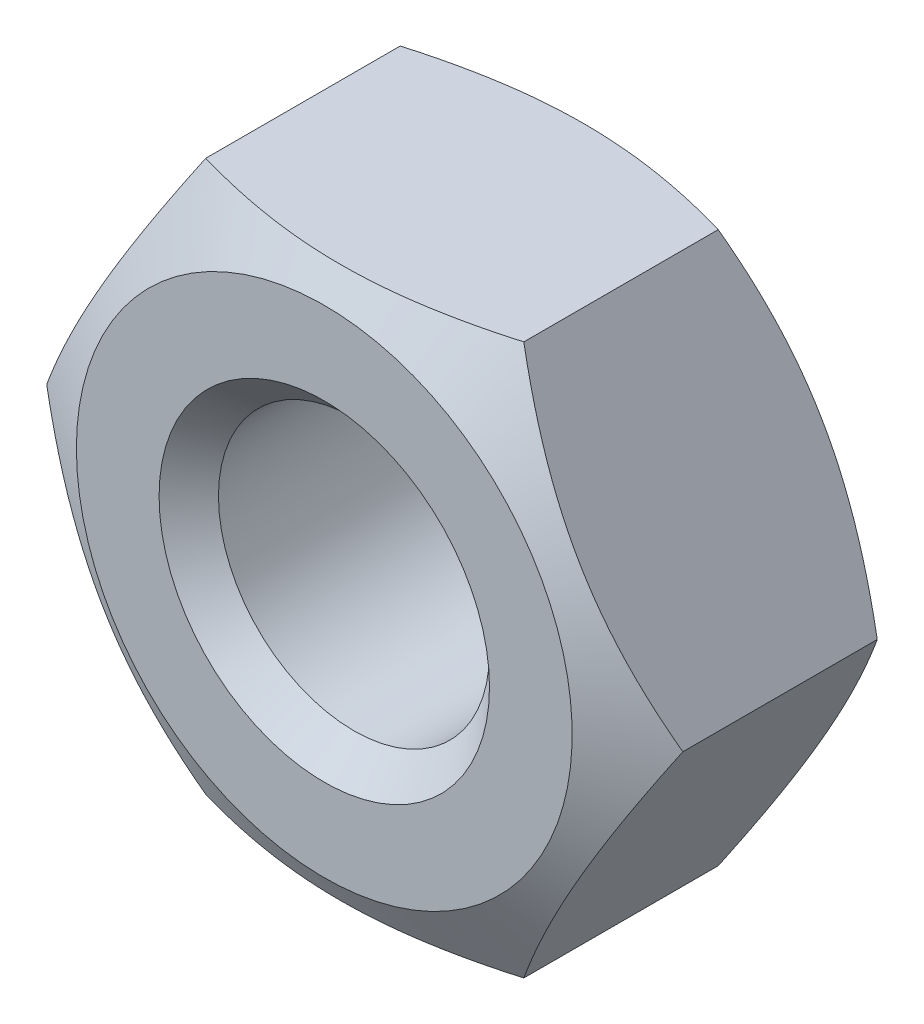
ISO-10303-21;
HEADER;
FILE_DESCRIPTION(('STEP AP214'),'2;1');
FILE_NAME('part.step','',(''),(''),'','','');
FILE_SCHEMA(('AUTOMOTIVE_DESIGN { 1 0 10303 214 1 1 1 1 }'));
ENDSEC;
DATA;
#1=APPLICATION_CONTEXT('core data for automotive mechanical design processes');
#2=APPLICATION_PROTOCOL_DEFINITION('international standard','automotive_design',2000,#1);
#3=PRODUCT_CONTEXT('',#1,'mechanical');
#4=PRODUCT('Part','Part','',(#3));
#5=PRODUCT_RELATED_PRODUCT_CATEGORY('part','',(#4));
#6=PRODUCT_DEFINITION_FORMATION('','',#4);
#7=PRODUCT_DEFINITION_CONTEXT('part definition',#1,'design');
#8=PRODUCT_DEFINITION('design','',#6,#7);
#9=PRODUCT_DEFINITION_SHAPE('','',#8);
#10=(LENGTH_UNIT() NAMED_UNIT(*) SI_UNIT(.MILLI.,.METRE.));
#11=(NAMED_UNIT(*) PLANE_ANGLE_UNIT() SI_UNIT($,.RADIAN.));
#12=(NAMED_UNIT(*) SI_UNIT($,.STERADIAN.) SOLID_ANGLE_UNIT());
#13=UNCERTAINTY_MEASURE_WITH_UNIT(LENGTH_MEASURE(1.E-05),#10,'distance_accuracy_value','');
#14=(GEOMETRIC_REPRESENTATION_CONTEXT(3) GLOBAL_UNCERTAINTY_ASSIGNED_CONTEXT((#13)) GLOBAL_UNIT_ASSIGNED_CONTEXT((#10,
#11,#12)) REPRESENTATION_CONTEXT('',''));
#15=CARTESIAN_POINT('',(0.,0.,0.));
#16=DIRECTION('',(0.,0.,1.));
#17=DIRECTION('',(1.,0.,0.));
#18=AXIS2_PLACEMENT_3D('',#15,#16,#17);
#19=CARTESIAN_POINT('',(2.88675134594651,-4.99999999999967,5.00000000000034));
#20=DIRECTION('',(-0.86602540378444,0.499999999999998,0.));
#21=DIRECTION('',(-0.5,-0.866025403784436,0.));
#22=AXIS2_PLACEMENT_3D('',#19,#20,#21);
#23=PLANE('',#22);
#24=DIRECTION('',(0.,0.,-1.));
#25=VECTOR('',#24,1.);
#26=CARTESIAN_POINT('',(5.7735026918968,1.11022302462516E-12,4.99999999999989));
#27=LINE('',#26,#25);
#28=CARTESIAN_POINT('',(5.77350269189703,3.33066907387547E-13,4.26474287801981));
#29=VERTEX_POINT('',#28);
#30=CARTESIAN_POINT('',(5.77350269189658,4.9960036108132E-13,0.735257121979638));
#31=VERTEX_POINT('',#30);
#32=EDGE_CURVE('E11',#29,#31,#27,.T.);
#33=ORIENTED_EDGE('',*,*,#32,.F.);
#34=CARTESIAN_POINT('',(5.77361816195054,0.000200000000338818,4.26467620935322));
#35=CARTESIAN_POINT('',(5.64675433465032,-0.219534594524167,4.33793829776813));
#36=CARTESIAN_POINT('',(5.51880543790509,-0.44114858445826,4.40457354348807));
#37=CARTESIAN_POINT('',(5.26069210252206,-0.88821399545187,4.52088587439572));
#38=CARTESIAN_POINT('',(5.1305230779462,-1.11367335958911,4.57052181549072));
#39=CARTESIAN_POINT('',(4.87177839004569,-1.56183230522188,4.64777383998765));
#40=CARTESIAN_POINT('',(4.74324302208332,-1.78446209310261,4.67590448712272));
#41=CARTESIAN_POINT('',(4.54998783160023,-2.11918990184482,4.70112994345301));
#42=CARTESIAN_POINT('',(4.4855253490501,-2.23084219680311,4.70671140563749));
#43=CARTESIAN_POINT('',(4.35654081066865,-2.4542499706723,4.71212264865472));
#44=CARTESIAN_POINT('',(4.29201875673899,-2.5660054462894,4.71195260714692));
#45=CARTESIAN_POINT('',(4.11524635305362,-2.87218423085036,4.70357123361224));
#46=CARTESIAN_POINT('',(4.00305457769097,-3.06650608596623,4.68949509350874));
#47=CARTESIAN_POINT('',(3.77941563226281,-3.45386010199632,4.6448596082978));
#48=CARTESIAN_POINT('',(3.66796924828281,-3.64689090137049,4.61428500525923));
#49=CARTESIAN_POINT('',(3.44387972423028,-4.03502534247406,4.53785637178519));
#50=CARTESIAN_POINT('',(3.33126486598544,-4.23007999864092,4.49167848652779));
#51=CARTESIAN_POINT('',(3.107714641578,-4.61728034535811,4.38687307091448));
#52=CARTESIAN_POINT('',(2.99677641204722,-4.80943099540761,4.32827016196887));
#53=CARTESIAN_POINT('',(2.88663587589388,-5.00020000000001,4.26467620935367));
#54=B_SPLINE_CURVE_WITH_KNOTS('',3,(#34,#35,#36,#37,#38,#39,#40,#41,#42,#43,#44,#45,#46,#47,#48,
#49,#50,#51,#52,#53),.UNSPECIFIED.,.F.,.F.,(4,2,2,2,2,2,2,2,2,4),(0.,0.792555841363204,
1.58701660053318,2.36181537487256,2.74884076077304,3.13585419177284,3.80962362599712,
4.48401723901251,5.17336882349008,5.86136694793849),.UNSPECIFIED.);
#55=CARTESIAN_POINT('',(2.88675134594696,-5.00000000000028,4.26474287802026));
#56=VERTEX_POINT('',#55);
#57=EDGE_CURVE('E195',#29,#56,#54,.T.);
#58=ORIENTED_EDGE('',*,*,#57,.T.);
#59=DIRECTION('',(0.,0.,-1.));
#60=VECTOR('',#59,1.);
#61=CARTESIAN_POINT('',(2.88675134594651,-4.99999999999967,5.00000000000034));
#62=LINE('',#61,#60);
#63=CARTESIAN_POINT('',(2.88675134594651,-4.99999999999989,0.735257121980304));
#64=VERTEX_POINT('',#63);
#65=EDGE_CURVE('E53',#56,#64,#62,.T.);
#66=ORIENTED_EDGE('',*,*,#65,.T.);
#67=CARTESIAN_POINT('',(2.88663587589322,-5.00020000000057,0.735323790646891));
#68=CARTESIAN_POINT('',(3.01349970319216,-4.78046540547511,0.662061702231952));
#69=CARTESIAN_POINT('',(3.14144859993679,-4.55885141554048,0.595426456512037));
#70=CARTESIAN_POINT('',(3.39956193531944,-4.11178600454618,0.479114125604423));
#71=CARTESIAN_POINT('',(3.52973095989552,-3.88632664040879,0.429478184509437));
#72=CARTESIAN_POINT('',(3.78847564779662,-3.43816769477587,0.352226160012454));
#73=CARTESIAN_POINT('',(3.91701101575935,-3.21553790689513,0.324095512877317));
#74=CARTESIAN_POINT('',(4.1102662062419,-2.8808100981523,0.298870056547364));
#75=CARTESIAN_POINT('',(4.17472868879166,-2.76915780319371,0.293288594363071));
#76=CARTESIAN_POINT('',(4.30371322717445,-2.54575002932512,0.287877351345449));
#77=CARTESIAN_POINT('',(4.3682352811058,-2.43399455370892,0.288047392852667));
#78=CARTESIAN_POINT('',(4.54500768479247,-2.12781576914886,0.296428766386961));
#79=CARTESIAN_POINT('',(4.65719946015232,-1.93349391403164,0.310504906491499));
#80=CARTESIAN_POINT('',(4.88083840557835,-1.54613989800073,0.355140391703246));
#81=CARTESIAN_POINT('',(4.99228478955902,-1.3531090986271,0.385714994741567));
#82=CARTESIAN_POINT('',(5.2163743136119,-0.964974657524056,0.462143628215454));
#83=CARTESIAN_POINT('',(5.3289891718564,-0.769920001357172,0.50832151347295));
#84=CARTESIAN_POINT('',(5.55253939626374,-0.382719654640242,0.613126929086239));
#85=CARTESIAN_POINT('',(5.66347762579476,-0.190569004591031,0.671729838031735));
#86=CARTESIAN_POINT('',(5.77361816194943,0.000200000000505351,0.735323790646447));
#87=B_SPLINE_CURVE_WITH_KNOTS('',3,(#67,#68,#69,#70,#71,#72,#73,#74,#75,#76,#77,#78,#79,#80,#81,
#82,#83,#84,#85,#86),.UNSPECIFIED.,.F.,.F.,(4,2,2,2,2,2,2,2,2,4),(0.,0.792555841363701,
1.58701660053438,2.36181537487431,2.74884076077502,3.13585419177501,3.80962362599876,
4.48401723901371,5.17336882349091,5.8613669479388),.UNSPECIFIED.);
#88=EDGE_CURVE('E125',#64,#31,#87,.T.);
#89=ORIENTED_EDGE('',*,*,#88,.T.);
#90=EDGE_LOOP('',(#33,#58,#66,#89));
#91=FACE_BOUND('',#90,.T.);
#92=ADVANCED_FACE('F30',(#91),#23,.F.);
#93=CARTESIAN_POINT('',(5.7735026918968,1.11022302462516E-12,4.99999999999989));
#94=DIRECTION('',(-0.866025403784439,-0.499999999999999,0.));
#95=DIRECTION('',(0.500000000000001,-0.866025403784435,0.));
#96=AXIS2_PLACEMENT_3D('',#93,#94,#95);
#97=PLANE('',#96);
#98=DIRECTION('',(0.,0.,-1.));
#99=VECTOR('',#98,1.);
#100=CARTESIAN_POINT('',(2.88675134594785,4.99999999999912,5.00000000000012));
#101=LINE('',#100,#99);
#102=CARTESIAN_POINT('',(2.88675134594785,4.99999999999923,4.26474287802003));
#103=VERTEX_POINT('',#102);
#104=CARTESIAN_POINT('',(2.88675134594829,4.99999999999989,0.735257121980082));
#105=VERTEX_POINT('',#104);
#106=EDGE_CURVE('E38',#103,#105,#101,.T.);
#107=ORIENTED_EDGE('',*,*,#106,.F.);
#108=CARTESIAN_POINT('',(2.88663587589411,5.00020000000007,4.26467620935345));
#109=CARTESIAN_POINT('',(3.01349970319411,4.7804654054752,4.33793829776738));
#110=CARTESIAN_POINT('',(3.1414485999392,4.55885141554098,4.4045735434868));
#111=CARTESIAN_POINT('',(3.39956193532214,4.11178600454721,4.52088587439398));
#112=CARTESIAN_POINT('',(3.52973095989805,3.88632664040994,4.57052181548904));
#113=CARTESIAN_POINT('',(3.78847564779869,3.43816769477716,4.64777383998622));
#114=CARTESIAN_POINT('',(3.91701101576113,3.21553790689645,4.67590448712149));
#115=CARTESIAN_POINT('',(4.11026620624405,2.88081009815417,4.70112994345121));
#116=CARTESIAN_POINT('',(4.17472868879406,2.76915780319585,4.70671140563535));
#117=CARTESIAN_POINT('',(4.30371322717577,2.54575002932691,4.71212264865361));
#118=CARTESIAN_POINT('',(4.3682352811058,2.43399455371008,4.71195260714718));
#119=CARTESIAN_POINT('',(4.54500768479139,2.1278157691495,4.70357123361362));
#120=CARTESIAN_POINT('',(4.65719946015328,1.93349391403345,4.68949509350797));
#121=CARTESIAN_POINT('',(4.88083840558086,1.54613989800332,4.64485960829548));
#122=CARTESIAN_POINT('',(4.99228478956102,1.35310909862928,4.61428500525755));
#123=CARTESIAN_POINT('',(5.21637431361363,0.96497465752581,4.53785637178403));
#124=CARTESIAN_POINT('',(5.32898917185835,0.76992000135892,4.49167848652651));
#125=CARTESIAN_POINT('',(5.55253939626585,0.382719654641867,4.38687307091319));
#126=CARTESIAN_POINT('',(5.66347762579679,0.190569004592535,4.3282701619677));
#127=CARTESIAN_POINT('',(5.77361816195077,-0.000199999999506151,4.26467620935322));
#128=B_SPLINE_CURVE_WITH_KNOTS('',3,(#108,#109,#110,#111,#112,#113,#114,#115,#116,#117,#118,
#119,#120,#121,#122,#123,#124,#125,#126,#127),.UNSPECIFIED.,.F.,.F.,(4,2,2,2,2,2,2,2,2,4),(0.,
0.792555841362968,1.58701660053319,2.36181537487258,2.74884076077297,3.13585419177259,
3.80962362599649,4.48401723901168,5.17336882348921,5.86136694793725),.UNSPECIFIED.);
#129=EDGE_CURVE('E190',#103,#29,#128,.T.);
#130=ORIENTED_EDGE('',*,*,#129,.T.);
#131=ORIENTED_EDGE('',*,*,#32,.T.);
#132=CARTESIAN_POINT('',(5.77361816194943,-0.000199999999894729,0.735323790646447));
#133=CARTESIAN_POINT('',(5.64675433465078,0.219534594525835,0.662061702232807));
#134=CARTESIAN_POINT('',(5.51880543790635,0.441148584460475,0.595426456513571));
#135=CARTESIAN_POINT('',(5.26069210252394,0.888213995454637,0.479114125606604));
#136=CARTESIAN_POINT('',(5.13052307794791,1.11367335959188,0.429478184511594));
#137=CARTESIAN_POINT('',(4.87177839004687,1.56183230522453,0.352226160014472));
#138=CARTESIAN_POINT('',(4.74324302208416,1.78446209310514,0.324095512879221));
#139=CARTESIAN_POINT('',(4.54998783160185,2.11918990184781,0.29887005654974));
#140=CARTESIAN_POINT('',(4.48552534905221,2.23084219680636,0.293288594365711));
#141=CARTESIAN_POINT('',(4.35654081066932,2.45424997067464,0.287877351347289));
#142=CARTESIAN_POINT('',(4.29201875673775,2.56600544629058,0.288047392853441));
#143=CARTESIAN_POINT('',(4.11524635305099,2.87218423085029,0.296428766386833));
#144=CARTESIAN_POINT('',(4.00305457769166,3.06650608596762,0.310504906493037));
#145=CARTESIAN_POINT('',(3.77941563226605,3.45386010199853,0.355140391705924));
#146=CARTESIAN_POINT('',(3.66796924828527,3.64689090137206,0.38571499474372));
#147=CARTESIAN_POINT('',(3.44387972423236,4.03502534247501,0.462143628217187));
#148=CARTESIAN_POINT('',(3.33126486598795,4.23007999864188,0.508321513474804));
#149=CARTESIAN_POINT('',(3.10771464158059,4.61728034535871,0.613126929087885));
#150=CARTESIAN_POINT('',(2.99677641204946,4.80943099540783,0.671729838033049));
#151=CARTESIAN_POINT('',(2.88663587589433,5.00019999999923,0.735323790646669));
#152=B_SPLINE_CURVE_WITH_KNOTS('',3,(#132,#133,#134,#135,#136,#137,#138,#139,#140,#141,#142,
#143,#144,#145,#146,#147,#148,#149,#150,#151),.UNSPECIFIED.,.F.,.F.,(4,2,2,2,2,2,2,2,2,4),(0.,
0.792555841362941,1.58701660053326,2.36181537487276,2.74884076077317,3.13585419177279,
3.80962362599622,4.484017239011,5.17336882348809,5.8613669479356),.UNSPECIFIED.);
#153=EDGE_CURVE('E121',#31,#105,#152,.T.);
#154=ORIENTED_EDGE('',*,*,#153,.T.);
#155=EDGE_LOOP('',(#107,#130,#131,#154));
#156=FACE_BOUND('',#155,.T.);
#157=ADVANCED_FACE('F123',(#156),#97,.F.);
#158=CARTESIAN_POINT('',(2.88675134594785,4.99999999999912,5.00000000000012));
#159=DIRECTION('',(0.,-0.999999999999997,0.));
#160=DIRECTION('',(0.,0.,-1.));
#161=AXIS2_PLACEMENT_3D('',#158,#159,#160);
#162=PLANE('',#161);
#163=DIRECTION('',(0.,0.,-1.));
#164=VECTOR('',#163,1.);
#165=CARTESIAN_POINT('',(-2.88675134594807,4.99999999999989,4.99999999999989));
#166=LINE('',#165,#164);
#167=CARTESIAN_POINT('',(-2.88675134594785,5.00000000000056,4.26474287802003));
#168=VERTEX_POINT('',#167);
#169=CARTESIAN_POINT('',(-2.88675134594829,5.00000000000034,0.735257121980082));
#170=VERTEX_POINT('',#169);
#171=EDGE_CURVE('E103',#168,#170,#166,.T.);
#172=ORIENTED_EDGE('',*,*,#171,.F.);
#173=CARTESIAN_POINT('',(-7.61612296469516,4.99999999999839,2.33799607846064));
#174=CARTESIAN_POINT('',(-7.39884761584428,4.99999999999886,2.44283125584233));
#175=CARTESIAN_POINT('',(-7.18105836137702,4.99999999999905,2.54662038295561));
#176=CARTESIAN_POINT('',(-6.74417816397951,4.99999999999919,2.75151519816452));
#177=CARTESIAN_POINT('',(-6.52508700904751,4.99999999999914,2.85262043369677));
#178=CARTESIAN_POINT('',(-6.08413259779606,4.9999999999991,3.05209472957686));
#179=CARTESIAN_POINT('',(-5.86226063985746,4.99999999999911,3.15044462367853));
#180=CARTESIAN_POINT('',(-5.41670278932317,4.99999999999912,3.34293015744737));
#181=CARTESIAN_POINT('',(-5.19301698742055,4.99999999999913,3.43706600630279));
#182=CARTESIAN_POINT('',(-4.73683335905498,4.99999999999911,3.62270915370095));
#183=CARTESIAN_POINT('',(-4.50427025640604,4.99999999999909,3.71405695849476));
#184=CARTESIAN_POINT('',(-4.0363727294118,4.99999999999914,3.88949857409126));
#185=CARTESIAN_POINT('',(-3.80103799041136,4.99999999999921,3.9735915520762));
#186=CARTESIAN_POINT('',(-3.3277098715686,4.99999999999903,4.13221424319585));
#187=CARTESIAN_POINT('',(-3.08972347412208,4.99999999999879,4.20676457448033));
#188=CARTESIAN_POINT('',(-2.61034124861959,4.99999999999945,4.34381945470585));
#189=CARTESIAN_POINT('',(-2.36894656459142,5.00000000000034,4.40632794708402));
#190=CARTESIAN_POINT('',(-1.88391072502227,5.00000000000033,4.51588915800451));
#191=CARTESIAN_POINT('',(-1.64028744335492,4.99999999999943,4.56301950933293));
#192=CARTESIAN_POINT('',(-1.15016208594569,4.9999999999988,4.63906338495994));
#193=CARTESIAN_POINT('',(-0.90366024104901,4.99999999999907,4.66797835995271));
#194=CARTESIAN_POINT('',(-0.412167836582522,4.99999999999917,4.70490486260694));
#195=CARTESIAN_POINT('',(-0.167197127141558,4.999999999999,4.71317414027045));
#196=CARTESIAN_POINT('',(0.322572125177844,4.99999999999923,4.70877873065052));
#197=CARTESIAN_POINT('',(0.567370661632867,4.99999999999963,4.69611329989415));
#198=CARTESIAN_POINT('',(0.987176681600054,4.99999999999951,4.657316154391));
#199=CARTESIAN_POINT('',(1.16264470383265,4.99999999999923,4.63591381054746));
#200=CARTESIAN_POINT('',(1.51219623582216,4.99999999999901,4.58376322784132));
#201=CARTESIAN_POINT('',(1.68627953550789,4.99999999999908,4.55301359767444));
#202=CARTESIAN_POINT('',(2.20627627442131,4.9999999999992,4.44837092854412));
#203=CARTESIAN_POINT('',(2.54972248494715,4.99999999999916,4.36210641311479));
#204=CARTESIAN_POINT('',(3.06312534043277,4.9999999999991,4.21379103367849));
#205=CARTESIAN_POINT('',(3.23577281563469,4.99999999999908,4.16053489421951));
#206=CARTESIAN_POINT('',(3.57938910996221,4.99999999999916,4.04881014905788));
#207=CARTESIAN_POINT('',(3.75035791830678,4.99999999999925,3.99034150990287));
#208=CARTESIAN_POINT('',(4.09067759310418,4.99999999999898,3.86910325251108));
#209=CARTESIAN_POINT('',(4.26002904118023,4.9999999999986,3.80633525226506));
#210=CARTESIAN_POINT('',(4.597350423009,4.99999999999963,3.67720475155376));
#211=CARTESIAN_POINT('',(4.76532036956876,5.00000000000103,3.61084228445391));
#212=CARTESIAN_POINT('',(5.14679238124372,5.00000000000147,3.45616790349058));
#213=CARTESIAN_POINT('',(5.35990712384152,4.99999999999975,3.36690277121853));
#214=CARTESIAN_POINT('',(5.78446139916688,4.99999999999848,3.18446413693718));
#215=CARTESIAN_POINT('',(5.99590085266589,4.99999999999895,3.09129045137898));
#216=CARTESIAN_POINT('',(6.41739680160826,4.99999999999929,2.90178352695365));
#217=CARTESIAN_POINT('',(6.62745306806027,4.99999999999916,2.80544977997106));
#218=CARTESIAN_POINT('',(7.04637313399045,4.99999999999907,2.61021998584572));
#219=CARTESIAN_POINT('',(7.25523691199795,4.9999999999991,2.51132389274453));
#220=CARTESIAN_POINT('',(7.88067587214187,4.99999999999915,2.21133680602415));
#221=CARTESIAN_POINT('',(8.2957452520423,4.99999999999913,2.00710789289028));
#222=CARTESIAN_POINT('',(9.12299779310592,4.99999999999911,1.59288698693724));
#223=CARTESIAN_POINT('',(9.5351808612509,4.99999999999911,1.38289480944637));
#224=CARTESIAN_POINT('',(10.1358760677506,4.99999999999912,1.07302702158893));
#225=CARTESIAN_POINT('',(10.3252343812012,4.99999999999912,0.974787078392633));
#226=CARTESIAN_POINT('',(10.7035454064949,4.99999999999911,0.777536780500673));
#227=CARTESIAN_POINT('',(10.8924981249519,4.99999999999911,0.678526438491425));
#228=CARTESIAN_POINT('',(11.4588410821139,4.99999999999913,0.380484654649799));
#229=CARTESIAN_POINT('',(11.8357030245098,4.99999999999918,0.180449229815591));
#230=CARTESIAN_POINT('',(12.5875213929432,4.99999999999905,-0.221246315951801));
#231=CARTESIAN_POINT('',(12.9624801710522,4.99999999999888,-0.422902042734687));
#232=CARTESIAN_POINT('',(13.711495868963,4.99999999999935,-0.827839848721258));
#233=CARTESIAN_POINT('',(14.08555283076,4.99999999999999,-1.03112185021253));
#234=CARTESIAN_POINT('',(14.45927341197,5.00000000000156,-1.23501663321091));
#235=B_SPLINE_CURVE_WITH_KNOTS('',3,(#173,#174,#175,#176,#177,#178,#179,#180,#181,#182,#183,
#184,#185,#186,#187,#188,#189,#190,#191,#192,#193,#194,#195,#196,#197,#198,#199,#200,#201,#202,
#203,#204,#205,#206,#207,#208,#209,#210,#211,#212,#213,#214,#215,#216,#217,#218,#219,#220,#221,
#222,#223,#224,#225,#226,#227,#228,#229,#230,#231,#232,#233,#234),.UNSPECIFIED.,.F.,.F.,(4,2,2,
2,2,2,2,2,2,2,2,2,2,2,2,2,2,2,2,2,2,2,2,2,2,2,2,2,2,2,4),(0.,0.723743565323072,1.44760840440166,
2.17565224855643,2.90365991191869,3.65314645187302,4.4027189149582,5.15064346196606,
5.89832266223335,6.64216678823801,7.38595166612203,8.1204033000757,8.8548810178242,
9.38492655137414,9.91505101863718,10.9759427430883,11.5179254075288,12.0599115505116,
12.6016948352157,13.1434730917073,13.8365852850354,14.529730064004,15.2229868473797,
15.9162560736825,17.3039592571643,18.6917069587137,19.3316812277018,19.9716449802296,
21.251616723548,22.5288486987301,23.8060200009782),.UNSPECIFIED.);
#236=EDGE_CURVE('E85',#168,#103,#235,.T.);
#237=ORIENTED_EDGE('',*,*,#236,.T.);
#238=ORIENTED_EDGE('',*,*,#106,.T.);
#239=CARTESIAN_POINT('',(-7.61612296469516,4.99999999999839,2.66200392153948));
#240=CARTESIAN_POINT('',(-7.39884761584433,4.99999999999886,2.55716874415773));
#241=CARTESIAN_POINT('',(-7.1810583613771,4.99999999999905,2.45337961704445));
#242=CARTESIAN_POINT('',(-6.74417816397964,4.99999999999919,2.24848480183555));
#243=CARTESIAN_POINT('',(-6.52508700904765,4.99999999999914,2.14737956630334));
#244=CARTESIAN_POINT('',(-6.08413259779619,4.9999999999991,1.94790527042327));
#245=CARTESIAN_POINT('',(-5.86226063985758,4.99999999999911,1.8495553763216));
#246=CARTESIAN_POINT('',(-5.41670278932325,4.99999999999913,1.65706984255278));
#247=CARTESIAN_POINT('',(-5.1930169874206,4.99999999999913,1.56293399369737));
#248=CARTESIAN_POINT('',(-4.73683335905503,4.99999999999911,1.37729084629925));
#249=CARTESIAN_POINT('',(-4.5042702564061,4.99999999999909,1.28594304150547));
#250=CARTESIAN_POINT('',(-4.03637272941187,4.99999999999914,1.110501425909));
#251=CARTESIAN_POINT('',(-3.80103799041144,4.99999999999921,1.02640844792405));
#252=CARTESIAN_POINT('',(-3.32770987156868,4.99999999999903,0.867785756804552));
#253=CARTESIAN_POINT('',(-3.08972347412216,4.99999999999879,0.793235425520244));
#254=CARTESIAN_POINT('',(-2.61034124861982,4.99999999999945,0.656180545294442));
#255=CARTESIAN_POINT('',(-2.36894656459181,5.00000000000035,0.593672052915829));
#256=CARTESIAN_POINT('',(-1.88391072502273,5.00000000000033,0.484110841995414));
#257=CARTESIAN_POINT('',(-1.64028744335528,4.99999999999943,0.436980490667518));
#258=CARTESIAN_POINT('',(-1.15016208594596,4.99999999999881,0.360936615040886));
#259=CARTESIAN_POINT('',(-0.903660241049296,4.9999999999991,0.332021640047967));
#260=CARTESIAN_POINT('',(-0.412167836582802,4.99999999999914,0.29509513739381));
#261=CARTESIAN_POINT('',(-0.167197127141824,4.9999999999989,0.28682585973053));
#262=CARTESIAN_POINT('',(0.322572125177624,4.99999999999934,0.291221269350079));
#263=CARTESIAN_POINT('',(0.567370661632679,5.00000000000001,0.303886700105834));
#264=CARTESIAN_POINT('',(0.98717668159977,4.99999999999981,0.342683845609207));
#265=CARTESIAN_POINT('',(1.16264470383227,4.99999999999931,0.364086189453217));
#266=CARTESIAN_POINT('',(1.51219623582167,4.99999999999893,0.416236772159716));
#267=CARTESIAN_POINT('',(1.68627953550739,4.99999999999905,0.446986402326483));
#268=CARTESIAN_POINT('',(2.20627627442077,4.99999999999925,0.551629071456613));
#269=CARTESIAN_POINT('',(2.54972248494659,4.99999999999916,0.637893586886028));
#270=CARTESIAN_POINT('',(3.06312534043216,4.99999999999909,0.786208966322369));
#271=CARTESIAN_POINT('',(3.23577281563406,4.99999999999908,0.839465105781339));
#272=CARTESIAN_POINT('',(3.57938910996156,4.99999999999915,0.951189850942913));
#273=CARTESIAN_POINT('',(3.75035791830614,4.99999999999923,1.00965849009787));
#274=CARTESIAN_POINT('',(4.09067759310345,4.99999999999901,1.13089674748978));
#275=CARTESIAN_POINT('',(4.26002904117941,4.99999999999871,1.19366474773596));
#276=CARTESIAN_POINT('',(4.59735042300831,4.99999999999952,1.32279524844673));
#277=CARTESIAN_POINT('',(4.76532036956832,5.00000000000063,1.38915771554587));
#278=CARTESIAN_POINT('',(5.14679238124333,5.00000000000098,1.54383209650897));
#279=CARTESIAN_POINT('',(5.35990712384081,4.99999999999962,1.63309722878186));
#280=CARTESIAN_POINT('',(5.78446139916596,4.99999999999862,1.81553586306382));
#281=CARTESIAN_POINT('',(5.99590085266509,4.99999999999898,1.90870954862181));
#282=CARTESIAN_POINT('',(6.41739680160759,4.99999999999925,2.09821647304699));
#283=CARTESIAN_POINT('',(6.6274530680596,4.99999999999915,2.19455022002965));
#284=CARTESIAN_POINT('',(7.04637313398984,4.99999999999908,2.38978001415506));
#285=CARTESIAN_POINT('',(7.25523691199738,4.9999999999991,2.48867610725624));
#286=CARTESIAN_POINT('',(7.88067587214144,4.99999999999914,2.78866319397664));
#287=CARTESIAN_POINT('',(8.29574525204195,4.99999999999912,2.99289210711056));
#288=CARTESIAN_POINT('',(9.12299779310574,4.99999999999911,3.40711301306369));
#289=CARTESIAN_POINT('',(9.53518086125083,4.99999999999911,3.6171051905546));
#290=CARTESIAN_POINT('',(10.1358760677507,4.99999999999912,3.92697297841211));
#291=CARTESIAN_POINT('',(10.3252343812014,4.99999999999912,4.02521292160843));
#292=CARTESIAN_POINT('',(10.7035454064951,4.99999999999911,4.22246321950045));
#293=CARTESIAN_POINT('',(10.8924981249522,4.99999999999911,4.32147356150973));
#294=CARTESIAN_POINT('',(11.4588410821144,4.99999999999912,4.61951534535144));
#295=CARTESIAN_POINT('',(11.8357030245104,4.99999999999916,4.81955077018569));
#296=CARTESIAN_POINT('',(12.5875213929439,4.99999999999907,5.2212463159532));
#297=CARTESIAN_POINT('',(12.9624801710531,4.99999999999894,5.42290204273615));
#298=CARTESIAN_POINT('',(13.711495868964,4.99999999999929,5.82783984872273));
#299=CARTESIAN_POINT('',(14.0855528307612,4.99999999999977,6.03112185021394));
#300=CARTESIAN_POINT('',(14.4592734119713,5.00000000000095,6.23501663321213));
#301=B_SPLINE_CURVE_WITH_KNOTS('',3,(#239,#240,#241,#242,#243,#244,#245,#246,#247,#248,#249,
#250,#251,#252,#253,#254,#255,#256,#257,#258,#259,#260,#261,#262,#263,#264,#265,#266,#267,#268,
#269,#270,#271,#272,#273,#274,#275,#276,#277,#278,#279,#280,#281,#282,#283,#284,#285,#286,#287,
#288,#289,#290,#291,#292,#293,#294,#295,#296,#297,#298,#299,#300),.UNSPECIFIED.,.F.,.F.,(4,2,2,
2,2,2,2,2,2,2,2,2,2,2,2,2,2,2,2,2,2,2,2,2,2,2,2,2,2,2,4),(0.,0.723743565322993,1.44760840440152,
2.17565224855633,2.90365991191863,3.65314645187291,4.40271891495806,5.15064346196582,
5.89832266223295,6.64216678823758,7.38595166612164,8.12040330007536,8.85488101782384,
9.38492655137365,9.9150510186366,10.9759427430877,11.5179254075281,12.0599115505109,
12.6016948352149,13.1434730917064,13.8365852850345,14.5297300640032,15.222986847379,
15.9162560736819,17.303959257164,18.6917069587137,19.331681227702,19.97164498023,
21.2516167235488,22.5288486987311,23.8060200009794),.UNSPECIFIED.);
#302=EDGE_CURVE('E113',#105,#170,#301,.F.);
#303=ORIENTED_EDGE('',*,*,#302,.T.);
#304=EDGE_LOOP('',(#172,#237,#238,#303));
#305=FACE_BOUND('',#304,.T.);
#306=ADVANCED_FACE('F112',(#305),#162,.F.);
#307=CARTESIAN_POINT('',(-2.88675134594807,4.99999999999989,4.99999999999989));
#308=DIRECTION('',(0.86602540378444,-0.499999999999998,0.));
#309=DIRECTION('',(0.5,0.866025403784436,0.));
#310=AXIS2_PLACEMENT_3D('',#307,#308,#309);
#311=PLANE('',#310);
#312=DIRECTION('',(0.,0.,-1.));
#313=VECTOR('',#312,1.);
#314=CARTESIAN_POINT('',(-5.77350269189658,4.44089209850063E-13,5.00000000000034));
#315=LINE('',#314,#313);
#316=CARTESIAN_POINT('',(-5.77350269189614,0.,4.26474287802048));
#317=VERTEX_POINT('',#316);
#318=CARTESIAN_POINT('',(-5.77350269189547,-1.33226762955019E-12,0.735257121980526));
#319=VERTEX_POINT('',#318);
#320=EDGE_CURVE('E94',#317,#319,#315,.T.);
#321=ORIENTED_EDGE('',*,*,#320,.F.);
#322=CARTESIAN_POINT('',(-5.77361816194943,-0.000200000001226996,4.26467620935389));
#323=CARTESIAN_POINT('',(-5.64675433465054,0.219534594524443,4.33793829776755));
#324=CARTESIAN_POINT('',(-5.51880543790594,0.441148584459056,4.40457354348686));
#325=CARTESIAN_POINT('',(-5.26069210252334,0.888213995453216,4.52088587439399));
#326=CARTESIAN_POINT('',(-5.13052307794729,1.11367335959049,4.57052181548908));
#327=CARTESIAN_POINT('',(-4.87177839004636,1.56183230522328,4.64777383998629));
#328=CARTESIAN_POINT('',(-4.74324302208379,1.78446209310401,4.67590448712155));
#329=CARTESIAN_POINT('',(-4.5499878316011,2.11918990184657,4.70112994345124));
#330=CARTESIAN_POINT('',(-4.48552534905124,2.23084219680502,4.70671140563537));
#331=CARTESIAN_POINT('',(-4.35654081066895,2.45424997067373,4.71212264865362));
#332=CARTESIAN_POINT('',(-4.29201875673819,2.56600544629018,4.71195260714719));
#333=CARTESIAN_POINT('',(-4.11524635305203,2.87218423085043,4.70357123361361));
#334=CARTESIAN_POINT('',(-4.00305457769129,3.0665060859671,4.68949509350791));
#335=CARTESIAN_POINT('',(-3.77941563226459,3.45386010199766,4.64485960829539));
#336=CARTESIAN_POINT('',(-3.66796924828415,3.6468909013715,4.61428500525745));
#337=CARTESIAN_POINT('',(-3.44387972423133,4.03502534247474,4.5378563717839));
#338=CARTESIAN_POINT('',(-3.33126486598666,4.23007999864161,4.49167848652635));
#339=CARTESIAN_POINT('',(-3.1077146415794,4.61728034535871,4.3868730709131));
#340=CARTESIAN_POINT('',(-2.99677641204863,4.80943099540811,4.3282701619677));
#341=CARTESIAN_POINT('',(-2.88663587589477,5.00020000000023,4.26467620935345));
#342=B_SPLINE_CURVE_WITH_KNOTS('',3,(#322,#323,#324,#325,#326,#327,#328,#329,#330,#331,#332,
#333,#334,#335,#336,#337,#338,#339,#340,#341),.UNSPECIFIED.,.F.,.F.,(4,2,2,2,2,2,2,2,2,4),(0.,
0.792555841363174,1.58701660053363,2.36181537487327,2.74884076077378,3.13585419177352,
3.8096236259973,4.48401723901239,5.1733688234898,5.86136694793769),.UNSPECIFIED.);
#343=EDGE_CURVE('E82',#317,#168,#342,.T.);
#344=ORIENTED_EDGE('',*,*,#343,.T.);
#345=ORIENTED_EDGE('',*,*,#171,.T.);
#346=CARTESIAN_POINT('',(-2.88663587589455,5.00019999999957,0.735323790646669));
#347=CARTESIAN_POINT('',(-3.01349970319386,4.78046540547431,0.662061702232675));
#348=CARTESIAN_POINT('',(-3.14144859993865,4.55885141553991,0.59542645651321));
#349=CARTESIAN_POINT('',(-3.39956193532136,4.11178600454602,0.479114125605969));
#350=CARTESIAN_POINT('',(-3.52973095989733,3.88632664040879,0.429478184510909));
#351=CARTESIAN_POINT('',(-3.78847564779805,3.43816769477608,0.352226160013756));
#352=CARTESIAN_POINT('',(-3.91701101576052,3.21553790689539,0.324095512878523));
#353=CARTESIAN_POINT('',(-4.11026620624333,2.88081009815305,0.298870056548697));
#354=CARTESIAN_POINT('',(-4.17472868879328,2.76915780319469,0.293288594364492));
#355=CARTESIAN_POINT('',(-4.3037132271752,2.54575002932584,0.287877351346415));
#356=CARTESIAN_POINT('',(-4.36823528110549,2.43399455370916,0.288047392853089));
#357=CARTESIAN_POINT('',(-4.54500768479132,2.12781576914866,0.296428766386841));
#358=CARTESIAN_POINT('',(-4.65719946015282,1.93349391403234,0.3105049064921));
#359=CARTESIAN_POINT('',(-4.8808384055801,1.54613989800197,0.355140391704299));
#360=CARTESIAN_POINT('',(-4.99228478956037,1.35310909862798,0.385714994742352));
#361=CARTESIAN_POINT('',(-5.21637431361311,0.964974657524561,0.462143628215949));
#362=CARTESIAN_POINT('',(-5.32898917185787,0.769920001357677,0.50832151347343));
#363=CARTESIAN_POINT('',(-5.55253939626518,0.382719654640497,0.613126929086783));
#364=CARTESIAN_POINT('',(-5.66347762579591,0.190569004591035,0.671729838032355));
#365=CARTESIAN_POINT('',(-5.77361816194943,-0.000200000001226996,0.735323790647113));
#366=B_SPLINE_CURVE_WITH_KNOTS('',3,(#346,#347,#348,#349,#350,#351,#352,#353,#354,#355,#356,
#357,#358,#359,#360,#361,#362,#363,#364,#365),.UNSPECIFIED.,.F.,.F.,(4,2,2,2,2,2,2,2,2,4),(0.,
0.792555841363011,1.58701660053319,2.36181537487258,2.74884076077298,3.13585419177263,
3.80962362599661,4.48401723901185,5.17336882348941,5.86136694793753),.UNSPECIFIED.);
#367=EDGE_CURVE('E102',#170,#319,#366,.T.);
#368=ORIENTED_EDGE('',*,*,#367,.T.);
#369=EDGE_LOOP('',(#321,#344,#345,#368));
#370=FACE_BOUND('',#369,.T.);
#371=ADVANCED_FACE('F100',(#370),#311,.F.);
#372=CARTESIAN_POINT('',(-5.77350269189658,4.44089209850063E-13,5.00000000000034));
#373=DIRECTION('',(0.866025403784439,0.499999999999999,0.));
#374=DIRECTION('',(-0.5,0.866025403784436,0.));
#375=AXIS2_PLACEMENT_3D('',#372,#373,#374);
#376=PLANE('',#375);
#377=DIRECTION('',(0.,0.,-1.));
#378=VECTOR('',#377,1.);
#379=CARTESIAN_POINT('',(-2.88675134594851,-5.00000000000056,5.00000000000034));
#380=LINE('',#379,#378);
#381=CARTESIAN_POINT('',(-2.88675134594851,-5.00000000000034,4.26474287802026));
#382=VERTEX_POINT('',#381);
#383=CARTESIAN_POINT('',(-2.8867513459494,-5.00000000000078,0.735257121980304));
#384=VERTEX_POINT('',#383);
#385=EDGE_CURVE('E96',#382,#384,#380,.T.);
#386=ORIENTED_EDGE('',*,*,#385,.F.);
#387=CARTESIAN_POINT('',(-2.88663587589477,-5.00020000000023,4.26467620935367));
#388=CARTESIAN_POINT('',(-3.01349970319388,-4.78046540547496,4.33793829776765));
#389=CARTESIAN_POINT('',(-3.14144859993853,-4.55885141554057,4.40457354348707));
#390=CARTESIAN_POINT('',(-3.39956193532107,-4.11178600454675,4.52088587439421));
#391=CARTESIAN_POINT('',(-3.52973095989702,-3.88632664040959,4.57052181548922));
#392=CARTESIAN_POINT('',(-3.78847564779776,-3.43816769477703,4.64777383998632));
#393=CARTESIAN_POINT('',(-3.91701101576028,-3.21553790689643,4.67590448712154));
#394=CARTESIAN_POINT('',(-4.11026620624287,-2.88081009815406,4.70112994345128));
#395=CARTESIAN_POINT('',(-4.1747286887927,-2.76915780319567,4.70671140563545));
#396=CARTESIAN_POINT('',(-4.30371322717491,-2.54575002932707,4.71212264865358));
#397=CARTESIAN_POINT('',(-4.36823528110561,-2.43399455371066,4.711952607147));
#398=CARTESIAN_POINT('',(-4.54500768479177,-2.12781576915039,4.70357123361331));
#399=CARTESIAN_POINT('',(-4.65719946015259,-1.93349391403366,4.68949509350786));
#400=CARTESIAN_POINT('',(-4.8808384055794,-1.54613989800297,4.64485960829553));
#401=CARTESIAN_POINT('',(-4.99228478955987,-1.35310909862906,4.61428500525752));
#402=CARTESIAN_POINT('',(-5.21637431361275,-0.964974657525688,4.53785637178387));
#403=CARTESIAN_POINT('',(-5.32898917185744,-0.76992000135877,4.49167848652627));
#404=CARTESIAN_POINT('',(-5.5525393962648,-0.382719654641536,4.38687307091312));
#405=CARTESIAN_POINT('',(-5.66347762579566,-0.190569004592053,4.32827016196785));
#406=CARTESIAN_POINT('',(-5.77361816194966,0.000200000000172285,4.26467620935389));
#407=B_SPLINE_CURVE_WITH_KNOTS('',3,(#387,#388,#389,#390,#391,#392,#393,#394,#395,#396,#397,
#398,#399,#400,#401,#402,#403,#404,#405,#406),.UNSPECIFIED.,.F.,.F.,(4,2,2,2,2,2,2,2,2,4),(0.,
0.792555841362743,1.5870166005327,2.36181537487192,2.74884076077223,3.13585419177177,
3.8096236259958,4.48401723901112,5.17336882348873,5.86136694793686),.UNSPECIFIED.);
#408=EDGE_CURVE('E45',#382,#317,#407,.T.);
#409=ORIENTED_EDGE('',*,*,#408,.T.);
#410=ORIENTED_EDGE('',*,*,#320,.T.);
#411=CARTESIAN_POINT('',(-5.77361816195054,0.000199999999228595,0.735323790647113));
#412=CARTESIAN_POINT('',(-5.64675433465082,-0.219534594525634,0.662061702232455));
#413=CARTESIAN_POINT('',(-5.51880543790586,-0.4411485844599,0.595426456512692));
#414=CARTESIAN_POINT('',(-5.26069210252304,-0.88821399545372,0.479114125605214));
#415=CARTESIAN_POINT('',(-5.13052307794712,-1.113673359591,0.429478184510214));
#416=CARTESIAN_POINT('',(-4.87177839004638,-1.56183230522372,0.352226160013146));
#417=CARTESIAN_POINT('',(-4.74324302208386,-1.78446209310437,0.324095512877939));
#418=CARTESIAN_POINT('',(-4.54998783160114,-2.11918990184678,0.298870056548015));
#419=CARTESIAN_POINT('',(-4.48552534905125,-2.23084219680518,0.293288594363755));
#420=CARTESIAN_POINT('',(-4.35654081066912,-2.45424997067394,0.287877351345868));
#421=CARTESIAN_POINT('',(-4.29201875673857,-2.56600544629049,0.288047392852789));
#422=CARTESIAN_POINT('',(-4.11524635305256,-2.87218423085084,0.296428766386753));
#423=CARTESIAN_POINT('',(-4.00305457769147,-3.06650608596738,0.31050490649163));
#424=CARTESIAN_POINT('',(-3.77941563226453,-3.45386010199783,0.355140391703557));
#425=CARTESIAN_POINT('',(-3.66796924828419,-3.64689090137171,0.385714994741721));
#426=CARTESIAN_POINT('',(-3.44387972423142,-4.03502534247497,0.462143628215378));
#427=CARTESIAN_POINT('',(-3.33126486598671,-4.23007999864183,0.508321513472807));
#428=CARTESIAN_POINT('',(-3.10771464157948,-4.61728034535893,0.613126929086185));
#429=CARTESIAN_POINT('',(-2.99677641204878,-4.80943099540834,0.671729838031839));
#430=CARTESIAN_POINT('',(-2.88663587589522,-5.00020000000045,0.735323790646891));
#431=B_SPLINE_CURVE_WITH_KNOTS('',3,(#411,#412,#413,#414,#415,#416,#417,#418,#419,#420,#421,
#422,#423,#424,#425,#426,#427,#428,#429,#430),.UNSPECIFIED.,.F.,.F.,(4,2,2,2,2,2,2,2,2,4),(0.,
0.792555841363136,1.58701660053333,2.36181537487272,2.74884076077315,3.13585419177284,
3.80962362599669,4.48401723901175,5.17336882348913,5.86136694793716),.UNSPECIFIED.);
#432=EDGE_CURVE('E163',#319,#384,#431,.T.);
#433=ORIENTED_EDGE('',*,*,#432,.T.);
#434=EDGE_LOOP('',(#386,#409,#410,#433));
#435=FACE_BOUND('',#434,.T.);
#436=ADVANCED_FACE('F92',(#435),#376,.F.);
#437=CARTESIAN_POINT('',(-2.88675134594851,-5.00000000000056,5.00000000000034));
#438=DIRECTION('',(0.,0.999999999999997,0.));
#439=DIRECTION('',(-1.,0.,0.));
#440=AXIS2_PLACEMENT_3D('',#437,#438,#439);
#441=PLANE('',#440);
#442=ORIENTED_EDGE('',*,*,#65,.F.);
#443=CARTESIAN_POINT('',(-7.61612296469583,-5.00000000000211,2.33799607846064));
#444=CARTESIAN_POINT('',(-7.3988476158448,-5.00000000000112,2.44283125584199));
#445=CARTESIAN_POINT('',(-7.18105836137748,-5.00000000000071,2.54662038295512));
#446=CARTESIAN_POINT('',(-6.74417816397994,-5.00000000000041,2.75151519816392));
#447=CARTESIAN_POINT('',(-6.52508700904795,-5.00000000000052,2.85262043369619));
#448=CARTESIAN_POINT('',(-6.08413259779648,-5.0000000000006,3.05209472957632));
#449=CARTESIAN_POINT('',(-5.86226063985785,-5.00000000000057,3.150444623678));
#450=CARTESIAN_POINT('',(-5.41670278932349,-5.00000000000055,3.34293015744684));
#451=CARTESIAN_POINT('',(-5.19301698742083,-5.00000000000055,3.43706600630227));
#452=CARTESIAN_POINT('',(-4.73683335905524,-5.00000000000057,3.62270915370043));
#453=CARTESIAN_POINT('',(-4.5042702564063,-5.00000000000058,3.71405695849422));
#454=CARTESIAN_POINT('',(-4.03637272941206,-5.00000000000054,3.88949857409074));
#455=CARTESIAN_POINT('',(-3.80103799041163,-5.00000000000048,3.97359155207572));
#456=CARTESIAN_POINT('',(-3.32770987156885,-5.00000000000064,4.13221424319523));
#457=CARTESIAN_POINT('',(-3.08972347412232,-5.00000000000086,4.20676457447952));
#458=CARTESIAN_POINT('',(-2.61034124862,-5.00000000000026,4.34381945470547));
#459=CARTESIAN_POINT('',(-2.36894656459203,-4.99999999999944,4.40632794708426));
#460=CARTESIAN_POINT('',(-1.88391072502295,-4.99999999999945,4.51588915800473));
#461=CARTESIAN_POINT('',(-1.64028744335546,-5.00000000000027,4.56301950933252));
#462=CARTESIAN_POINT('',(-1.1501620859461,-5.00000000000085,4.6390633849591));
#463=CARTESIAN_POINT('',(-0.903660241049428,-5.0000000000006,4.66797835995208));
#464=CARTESIAN_POINT('',(-0.412167836582907,-5.00000000000052,4.70490486260637));
#465=CARTESIAN_POINT('',(-0.167197127141904,-5.00000000000068,4.71317414026972));
#466=CARTESIAN_POINT('',(0.322572125177581,-5.00000000000044,4.70877873065011));
#467=CARTESIAN_POINT('',(0.567370661632648,-5.00000000000005,4.69611329989422));
#468=CARTESIAN_POINT('',(0.987176681599799,-5.00000000000016,4.65731615439095));
#469=CARTESIAN_POINT('',(1.16264470383234,-5.00000000000045,4.63591381054708));
#470=CARTESIAN_POINT('',(1.51219623582179,-5.00000000000067,4.5837632278407));
#471=CARTESIAN_POINT('',(1.68627953550753,-5.0000000000006,4.55301359767391));
#472=CARTESIAN_POINT('',(2.20627627442097,-5.00000000000048,4.44837092854377));
#473=CARTESIAN_POINT('',(2.54972248494683,-5.00000000000054,4.36210641311439));
#474=CARTESIAN_POINT('',(3.06312534043246,-5.00000000000057,4.21379103367808));
#475=CARTESIAN_POINT('',(3.23577281563438,-5.00000000000057,4.16053489421911));
#476=CARTESIAN_POINT('',(3.57938910996191,-5.00000000000055,4.04881014905753));
#477=CARTESIAN_POINT('',(3.7503579183065,-5.00000000000054,3.99034150990257));
#478=CARTESIAN_POINT('',(4.09067759310385,-5.00000000000058,3.86910325251068));
#479=CARTESIAN_POINT('',(4.26002904117983,-5.00000000000064,3.80633525226452));
#480=CARTESIAN_POINT('',(4.59735042300875,-5.00000000000048,3.67720475155369));
#481=CARTESIAN_POINT('',(4.76532036956874,-5.00000000000026,3.61084228445448));
#482=CARTESIAN_POINT('',(5.1467923812437,-5.00000000000019,3.45616790349139));
#483=CARTESIAN_POINT('',(5.35990712384114,-5.00000000000046,3.36690277121862));
#484=CARTESIAN_POINT('',(5.78446139916617,-5.00000000000066,3.18446413693679));
#485=CARTESIAN_POINT('',(5.99590085266522,-5.00000000000059,3.09129045137882));
#486=CARTESIAN_POINT('',(6.41739680160758,-5.00000000000053,2.90178352695369));
#487=CARTESIAN_POINT('',(6.62745306805952,-5.00000000000055,2.80544977997108));
#488=CARTESIAN_POINT('',(7.04637313398961,-5.00000000000057,2.61021998584576));
#489=CARTESIAN_POINT('',(7.25523691199709,-5.00000000000056,2.51132389274461));
#490=CARTESIAN_POINT('',(7.88067587214093,-5.00000000000056,2.21133680602433));
#491=CARTESIAN_POINT('',(8.29574525204129,-5.00000000000056,2.00710789289049));
#492=CARTESIAN_POINT('',(9.1229977931048,-5.00000000000056,1.59288698693753));
#493=CARTESIAN_POINT('',(9.53518086124974,-5.00000000000056,1.38289480944671));
#494=CARTESIAN_POINT('',(10.1358760677494,-5.00000000000056,1.07302702158931));
#495=CARTESIAN_POINT('',(10.3252343812,-5.00000000000056,0.974787078393014));
#496=CARTESIAN_POINT('',(10.7035454064936,-5.00000000000056,0.777536780501064));
#497=CARTESIAN_POINT('',(10.8924981249506,-5.00000000000057,0.678526438491822));
#498=CARTESIAN_POINT('',(11.4588410821127,-5.00000000000055,0.380484654650208));
#499=CARTESIAN_POINT('',(11.8357030245086,-5.0000000000005,0.180449229815999));
#500=CARTESIAN_POINT('',(12.587521392942,-5.00000000000062,-0.221246315951348));
#501=CARTESIAN_POINT('',(12.962480171051,-5.00000000000079,-0.422902042734187));
#502=CARTESIAN_POINT('',(13.7114958689617,-5.00000000000034,-0.827839848720777));
#503=CARTESIAN_POINT('',(14.0855528307586,-4.99999999999973,-1.03112185021211));
#504=CARTESIAN_POINT('',(14.4592734119684,-4.99999999999823,-1.23501663321068));
#505=B_SPLINE_CURVE_WITH_KNOTS('',3,(#443,#444,#445,#446,#447,#448,#449,#450,#451,#452,#453,
#454,#455,#456,#457,#458,#459,#460,#461,#462,#463,#464,#465,#466,#467,#468,#469,#470,#471,#472,
#473,#474,#475,#476,#477,#478,#479,#480,#481,#482,#483,#484,#485,#486,#487,#488,#489,#490,#491,
#492,#493,#494,#495,#496,#497,#498,#499,#500,#501,#502,#503,#504),.UNSPECIFIED.,.F.,.F.,(4,2,2,
2,2,2,2,2,2,2,2,2,2,2,2,2,2,2,2,2,2,2,2,2,2,2,2,2,2,2,4),(0.,0.723743565323033,1.44760840440161,
2.17565224855649,2.90365991191885,3.65314645187315,4.40271891495834,5.15064346196613,
5.89832266223328,6.64216678823796,7.38595166612206,8.12040330007584,8.85488101782439,
9.38492655137427,9.91505101863728,10.9759427430885,11.5179254075289,12.0599115505118,
12.6016948352158,13.1434730917073,13.8365852850352,14.5297300640037,15.2229868473793,
15.9162560736819,17.3039592571635,18.6917069587127,19.3316812277008,19.9716449802286,
21.251616723547,22.528848698729,23.806020000977),.UNSPECIFIED.);
#506=EDGE_CURVE('E97',#56,#382,#505,.F.);
#507=ORIENTED_EDGE('',*,*,#506,.T.);
#508=ORIENTED_EDGE('',*,*,#385,.T.);
#509=CARTESIAN_POINT('',(-7.6161229646956,-5.00000000000145,2.66200392153948));
#510=CARTESIAN_POINT('',(-7.39884761584479,-5.00000000000088,2.55716874415764));
#511=CARTESIAN_POINT('',(-7.18105836137755,-5.00000000000064,2.45337961704431));
#512=CARTESIAN_POINT('',(-6.74417816398006,-5.00000000000047,2.24848480183535));
#513=CARTESIAN_POINT('',(-6.52508700904804,-5.00000000000054,2.14737956630313));
#514=CARTESIAN_POINT('',(-6.08413259779659,-5.00000000000058,1.94790527042305));
#515=CARTESIAN_POINT('',(-5.862260639858,-5.00000000000057,1.84955537632137));
#516=CARTESIAN_POINT('',(-5.41670278932372,-5.00000000000055,1.65706984255255));
#517=CARTESIAN_POINT('',(-5.19301698742109,-5.00000000000055,1.56293399369713));
#518=CARTESIAN_POINT('',(-4.73683335905554,-5.00000000000057,1.37729084629898));
#519=CARTESIAN_POINT('',(-4.50427025640662,-5.00000000000058,1.28594304150518));
#520=CARTESIAN_POINT('',(-4.0363727294124,-5.00000000000054,1.1105014259087));
#521=CARTESIAN_POINT('',(-3.80103799041197,-5.00000000000048,1.02640844792378));
#522=CARTESIAN_POINT('',(-3.32770987156923,-5.00000000000064,0.867785756804139));
#523=CARTESIAN_POINT('',(-3.08972347412274,-5.00000000000086,0.793235425519664));
#524=CARTESIAN_POINT('',(-2.61034124862025,-5.00000000000026,0.656180545294197));
#525=CARTESIAN_POINT('',(-2.36894656459208,-4.99999999999944,0.593672052916088));
#526=CARTESIAN_POINT('',(-1.88391072502296,-4.99999999999945,0.484110841995611));
#527=CARTESIAN_POINT('',(-1.64028744335562,-5.00000000000027,0.436980490667152));
#528=CARTESIAN_POINT('',(-1.15016208594644,-5.00000000000085,0.360936615040145));
#529=CARTESIAN_POINT('',(-0.903660241049781,-5.0000000000006,0.33202164004741));
#530=CARTESIAN_POINT('',(-0.412167836583328,-5.00000000000052,0.295095137393173));
#531=CARTESIAN_POINT('',(-0.167197127142378,-5.00000000000068,0.286825859729633));
#532=CARTESIAN_POINT('',(0.322572125176986,-5.00000000000044,0.291221269349686));
#533=CARTESIAN_POINT('',(0.567370661631985,-5.00000000000005,0.303886700106208));
#534=CARTESIAN_POINT('',(0.987176681599194,-5.00000000000016,0.342683845609325));
#535=CARTESIAN_POINT('',(1.16264470383183,-5.00000000000045,0.364086189452757));
#536=CARTESIAN_POINT('',(1.51219623582139,-5.00000000000067,0.416236772158832));
#537=CARTESIAN_POINT('',(1.68627953550714,-5.0000000000006,0.446986402325752));
#538=CARTESIAN_POINT('',(2.2062762744206,-5.00000000000049,0.551629071456142));
#539=CARTESIAN_POINT('',(2.54972248494647,-5.00000000000055,0.637893586885469));
#540=CARTESIAN_POINT('',(3.06312534043214,-5.00000000000057,0.786208966321797));
#541=CARTESIAN_POINT('',(3.23577281563408,-5.00000000000056,0.839465105780785));
#542=CARTESIAN_POINT('',(3.57938910996162,-5.00000000000056,0.951189850942437));
#543=CARTESIAN_POINT('',(3.75035791830621,-5.00000000000057,1.00965849009745));
#544=CARTESIAN_POINT('',(4.09067759310363,-5.00000000000055,1.13089674748927));
#545=CARTESIAN_POINT('',(4.2600290411797,-5.00000000000051,1.19366474773532));
#546=CARTESIAN_POINT('',(4.59735042300851,-5.00000000000061,1.32279524844661));
#547=CARTESIAN_POINT('',(4.7653203695683,-5.00000000000076,1.38915771554642));
#548=CARTESIAN_POINT('',(5.14679238124328,-5.00000000000081,1.54383209650976));
#549=CARTESIAN_POINT('',(5.35990712384107,-5.00000000000063,1.63309722878187));
#550=CARTESIAN_POINT('',(5.78446139916644,-5.0000000000005,1.81553586306328));
#551=CARTESIAN_POINT('',(5.99590085266547,-5.00000000000054,1.90870954862148));
#552=CARTESIAN_POINT('',(6.41739680160787,-5.00000000000058,2.09821647304682));
#553=CARTESIAN_POINT('',(6.62745306805988,-5.00000000000057,2.19455022002942));
#554=CARTESIAN_POINT('',(7.04637313399009,-5.00000000000056,2.38978001415478));
#555=CARTESIAN_POINT('',(7.25523691199761,-5.00000000000056,2.48867610725597));
#556=CARTESIAN_POINT('',(7.88067587214156,-5.00000000000056,2.78866319397638));
#557=CARTESIAN_POINT('',(8.295745252042,-5.00000000000056,2.99289210711027));
#558=CARTESIAN_POINT('',(9.12299779310566,-5.00000000000056,3.40711301306334));
#559=CARTESIAN_POINT('',(9.53518086125067,-5.00000000000056,3.61710519055422));
#560=CARTESIAN_POINT('',(10.1358760677505,-5.00000000000056,3.92697297841169));
#561=CARTESIAN_POINT('',(10.3252343812011,-5.00000000000056,4.025212921608));
#562=CARTESIAN_POINT('',(10.7035454064947,-5.00000000000056,4.22246321949998));
#563=CARTESIAN_POINT('',(10.8924981249517,-5.00000000000057,4.32147356150923));
#564=CARTESIAN_POINT('',(11.4588410821138,-5.00000000000055,4.6195153453509));
#565=CARTESIAN_POINT('',(11.8357030245098,-5.0000000000005,4.81955077018514));
#566=CARTESIAN_POINT('',(12.5875213929432,-5.00000000000062,5.22124631595254));
#567=CARTESIAN_POINT('',(12.9624801710523,-5.0000000000008,5.42290204273539));
#568=CARTESIAN_POINT('',(13.7114958689631,-5.00000000000033,5.82783984872216));
#569=CARTESIAN_POINT('',(14.0855528307601,-4.99999999999969,6.03112185021366));
#570=CARTESIAN_POINT('',(14.4592734119697,-4.99999999999812,6.23501663321258));
#571=B_SPLINE_CURVE_WITH_KNOTS('',3,(#509,#510,#511,#512,#513,#514,#515,#516,#517,#518,#519,
#520,#521,#522,#523,#524,#525,#526,#527,#528,#529,#530,#531,#532,#533,#534,#535,#536,#537,#538,
#539,#540,#541,#542,#543,#544,#545,#546,#547,#548,#549,#550,#551,#552,#553,#554,#555,#556,#557,
#558,#559,#560,#561,#562,#563,#564,#565,#566,#567,#568,#569,#570),.UNSPECIFIED.,.F.,.F.,(4,2,2,
2,2,2,2,2,2,2,2,2,2,2,2,2,2,2,2,2,2,2,2,2,2,2,2,2,2,2,4),(0.,0.72374356532308,1.44760840440168,
2.17565224855643,2.90365991191868,3.65314645187296,4.40271891495809,5.15064346196591,
5.89832266223317,6.64216678823778,7.38595166612173,8.12040330007535,8.85488101782381,
9.38492655137382,9.91505101863692,10.9759427430882,11.5179254075287,12.0599115505116,
12.6016948352157,13.1434730917074,13.8365852850355,14.5297300640041,15.2229868473799,
15.9162560736827,17.3039592571646,18.6917069587141,19.3316812277023,19.9716449802301,
21.2516167235486,22.5288486987308,23.806020000979),.UNSPECIFIED.);
#572=EDGE_CURVE('E154',#384,#64,#571,.T.);
#573=ORIENTED_EDGE('',*,*,#572,.T.);
#574=EDGE_LOOP('',(#442,#507,#508,#573));
#575=FACE_BOUND('',#574,.T.);
#576=ADVANCED_FACE('F146',(#575),#441,.F.);
#577=CARTESIAN_POINT('',(-4.44089209850063E-13,-1.27675647831893E-12,0.735257121980082));
#578=DIRECTION('',(0.,0.,1.));
#579=DIRECTION('',(1.,0.,0.));
#580=AXIS2_PLACEMENT_3D('',#577,#578,#579);
#581=CONICAL_SURFACE('',#580,5.77350269189626,1.0471975511966);
#582=CARTESIAN_POINT('',(0.,0.,0.));
#583=DIRECTION('',(0.,0.,-1.));
#584=DIRECTION('',(-1.,0.,0.));
#585=AXIS2_PLACEMENT_3D('',#582,#583,#584);
#586=CIRCLE('',#585,4.5);
#587=CARTESIAN_POINT('',(-4.50000000000001,0.,0.));
#588=VERTEX_POINT('',#587);
#589=EDGE_CURVE('E199',#588,#588,#586,.T.);
#590=ORIENTED_EDGE('',*,*,#589,.F.);
#591=EDGE_LOOP('',(#590));
#592=FACE_BOUND('',#591,.T.);
#593=ORIENTED_EDGE('',*,*,#572,.F.);
#594=ORIENTED_EDGE('',*,*,#432,.F.);
#595=ORIENTED_EDGE('',*,*,#367,.F.);
#596=ORIENTED_EDGE('',*,*,#302,.F.);
#597=ORIENTED_EDGE('',*,*,#153,.F.);
#598=ORIENTED_EDGE('',*,*,#88,.F.);
#599=EDGE_LOOP('',(#593,#594,#595,#596,#597,#598));
#600=FACE_BOUND('',#599,.T.);
#601=ADVANCED_FACE('F120',(#592,#600),#581,.T.);
#602=CARTESIAN_POINT('',(-1.11022302462516E-12,-9.99999999999979,4.44089209850063E-13));
#603=DIRECTION('',(0.,0.,-1.));
#604=DIRECTION('',(-1.,0.,0.));
#605=AXIS2_PLACEMENT_3D('',#602,#603,#604);
#606=PLANE('',#605);
#607=CARTESIAN_POINT('',(0.,0.,0.));
#608=DIRECTION('',(0.,0.,-1.));
#609=DIRECTION('',(-1.,0.,0.));
#610=AXIS2_PLACEMENT_3D('',#607,#608,#609);
#611=CIRCLE('',#610,3.);
#612=CARTESIAN_POINT('',(-3.,0.,0.));
#613=VERTEX_POINT('',#612);
#614=EDGE_CURVE('E294',#613,#613,#611,.T.);
#615=ORIENTED_EDGE('',*,*,#614,.F.);
#616=EDGE_LOOP('',(#615));
#617=FACE_BOUND('',#616,.T.);
#618=ORIENTED_EDGE('',*,*,#589,.T.);
#619=EDGE_LOOP('',(#618));
#620=FACE_BOUND('',#619,.T.);
#621=ADVANCED_FACE('F145',(#617,#620),#606,.T.);
#622=CARTESIAN_POINT('',(6.66133814775094E-13,-2.22044604925031E-13,5.00000000000012));
#623=DIRECTION('',(0.,0.,-1.));
#624=DIRECTION('',(-1.,0.,0.));
#625=AXIS2_PLACEMENT_3D('',#622,#623,#624);
#626=CONICAL_SURFACE('',#625,4.5,1.0471975511966);
#627=CARTESIAN_POINT('',(6.66133814775094E-13,-2.22044604925031E-13,5.00000000000012));
#628=DIRECTION('',(0.,0.,-1.));
#629=DIRECTION('',(-1.,0.,0.));
#630=AXIS2_PLACEMENT_3D('',#627,#628,#629);
#631=CIRCLE('',#630,4.5);
#632=CARTESIAN_POINT('',(-4.49999999999934,-2.24167906459627E-13,5.00000000000011));
#633=VERTEX_POINT('',#632);
#634=EDGE_CURVE('E205',#633,#633,#631,.T.);
#635=ORIENTED_EDGE('',*,*,#634,.T.);
#636=EDGE_LOOP('',(#635));
#637=FACE_BOUND('',#636,.T.);
#638=ORIENTED_EDGE('',*,*,#129,.F.);
#639=ORIENTED_EDGE('',*,*,#236,.F.);
#640=ORIENTED_EDGE('',*,*,#343,.F.);
#641=ORIENTED_EDGE('',*,*,#408,.F.);
#642=ORIENTED_EDGE('',*,*,#506,.F.);
#643=ORIENTED_EDGE('',*,*,#57,.F.);
#644=EDGE_LOOP('',(#638,#639,#640,#641,#642,#643));
#645=FACE_BOUND('',#644,.T.);
#646=ADVANCED_FACE('F83',(#637,#645),#626,.T.);
#647=CARTESIAN_POINT('',(-1.11022302462516E-12,-10.0000000000007,5.00000000000034));
#648=DIRECTION('',(0.,0.,-1.));
#649=DIRECTION('',(-1.,0.,0.));
#650=AXIS2_PLACEMENT_3D('',#647,#648,#649);
#651=PLANE('',#650);
#652=CARTESIAN_POINT('',(6.66133814775094E-13,-2.22044604925031E-13,5.00000000000012));
#653=DIRECTION('',(0.,0.,-1.));
#654=DIRECTION('',(-1.,0.,0.));
#655=AXIS2_PLACEMENT_3D('',#652,#653,#654);
#656=CIRCLE('',#655,2.999);
#657=CARTESIAN_POINT('',(-2.99899999999934,-2.23459667436643E-13,5.00000000000011));
#658=VERTEX_POINT('',#657);
#659=EDGE_CURVE('E207',#658,#658,#656,.T.);
#660=ORIENTED_EDGE('',*,*,#659,.T.);
#661=EDGE_LOOP('',(#660));
#662=FACE_BOUND('',#661,.T.);
#663=ORIENTED_EDGE('',*,*,#634,.F.);
#664=EDGE_LOOP('',(#663));
#665=FACE_BOUND('',#664,.T.);
#666=ADVANCED_FACE('F215',(#662,#665),#651,.F.);
#667=CARTESIAN_POINT('',(0.,0.,0.));
#668=DIRECTION('',(0.,0.,-1.));
#669=DIRECTION('',(-1.,0.,0.));
#670=AXIS2_PLACEMENT_3D('',#667,#668,#669);
#671=CONICAL_SURFACE('',#670,3.,0.78539816339745);
#672=CARTESIAN_POINT('',(0.,0.,0.539999999999985));
#673=DIRECTION('',(0.,0.,-1.));
#674=DIRECTION('',(-1.,0.,0.));
#675=AXIS2_PLACEMENT_3D('',#672,#673,#674);
#676=CIRCLE('',#675,2.46);
#677=CARTESIAN_POINT('',(-2.46,0.,0.539999999999983));
#678=VERTEX_POINT('',#677);
#679=EDGE_CURVE('E291',#678,#678,#676,.T.);
#680=ORIENTED_EDGE('',*,*,#679,.F.);
#681=EDGE_LOOP('',(#680));
#682=FACE_BOUND('',#681,.T.);
#683=ORIENTED_EDGE('',*,*,#614,.T.);
#684=EDGE_LOOP('',(#683));
#685=FACE_BOUND('',#684,.T.);
#686=ADVANCED_FACE('F218',(#682,#685),#671,.F.);
#687=CARTESIAN_POINT('',(0.,0.,0.));
#688=DIRECTION('',(0.,0.,-1.));
#689=DIRECTION('',(-1.,0.,0.));
#690=AXIS2_PLACEMENT_3D('',#687,#688,#689);
#691=CYLINDRICAL_SURFACE('',#690,2.46);
#692=CARTESIAN_POINT('',(0.,4.44089209850063E-13,4.46099999999983));
#693=DIRECTION('',(0.,0.,-1.));
#694=DIRECTION('',(-1.,0.,0.));
#695=AXIS2_PLACEMENT_3D('',#692,#693,#694);
#696=CIRCLE('',#695,2.46);
#697=CARTESIAN_POINT('',(-2.46,4.42928471677817E-13,4.46099999999982));
#698=VERTEX_POINT('',#697);
#699=EDGE_CURVE('E290',#698,#698,#696,.T.);
#700=ORIENTED_EDGE('',*,*,#699,.F.);
#701=EDGE_LOOP('',(#700));
#702=FACE_BOUND('',#701,.T.);
#703=ORIENTED_EDGE('',*,*,#679,.T.);
#704=EDGE_LOOP('',(#703));
#705=FACE_BOUND('',#704,.T.);
#706=ADVANCED_FACE('F224',(#702,#705),#691,.F.);
#707=CARTESIAN_POINT('',(0.,4.44089209850063E-13,4.46099999999983));
#708=DIRECTION('',(0.,0.,1.));
#709=DIRECTION('',(1.,0.,0.));
#710=AXIS2_PLACEMENT_3D('',#707,#708,#709);
#711=CONICAL_SURFACE('',#710,2.46,0.78539816339745);
#712=ORIENTED_EDGE('',*,*,#659,.F.);
#713=EDGE_LOOP('',(#712));
#714=FACE_BOUND('',#713,.T.);
#715=ORIENTED_EDGE('',*,*,#699,.T.);
#716=EDGE_LOOP('',(#715));
#717=FACE_BOUND('',#716,.T.);
#718=ADVANCED_FACE('F276',(#714,#717),#711,.F.);
#719=CLOSED_SHELL('',(#92,#157,#306,#371,#436,#576,#601,#621,#646,#666,#686,#706,#718));
#720=MANIFOLD_SOLID_BREP('B2',#719);
#721=ADVANCED_BREP_SHAPE_REPRESENTATION('',(#18,#720),#14);
#722=SHAPE_DEFINITION_REPRESENTATION(#9,#721);
ENDSEC;
END-ISO-10303-21;
